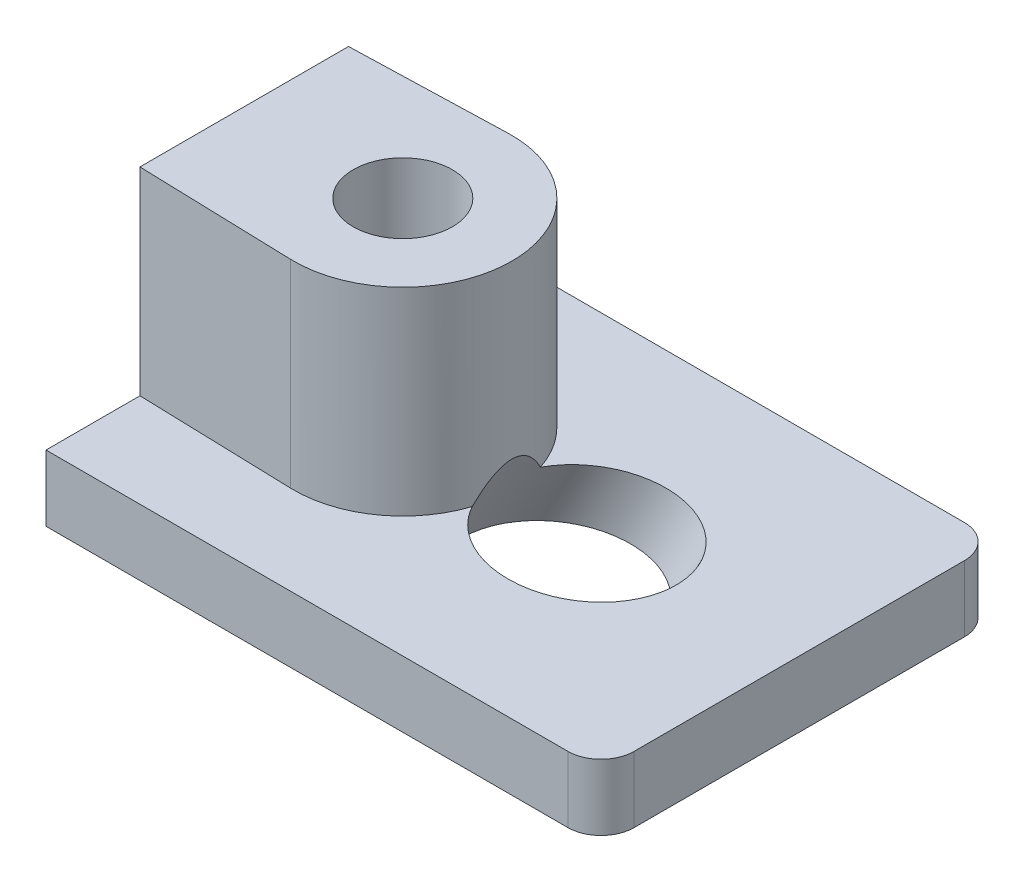
ISO-10303-21;
HEADER;
FILE_DESCRIPTION(('STEP AP214'),'2;1');
FILE_NAME('part.step','',(''),(''),'','','');
FILE_SCHEMA(('AUTOMOTIVE_DESIGN { 1 0 10303 214 1 1 1 1 }'));
ENDSEC;
DATA;
#1=APPLICATION_CONTEXT('core data for automotive mechanical design processes');
#2=APPLICATION_PROTOCOL_DEFINITION('international standard','automotive_design',2000,#1);
#3=PRODUCT_CONTEXT('',#1,'mechanical');
#4=PRODUCT('Part','Part','',(#3));
#5=PRODUCT_RELATED_PRODUCT_CATEGORY('part','',(#4));
#6=PRODUCT_DEFINITION_FORMATION('','',#4);
#7=PRODUCT_DEFINITION_CONTEXT('part definition',#1,'design');
#8=PRODUCT_DEFINITION('design','',#6,#7);
#9=PRODUCT_DEFINITION_SHAPE('','',#8);
#10=(LENGTH_UNIT() NAMED_UNIT(*) SI_UNIT(.MILLI.,.METRE.));
#11=(NAMED_UNIT(*) PLANE_ANGLE_UNIT() SI_UNIT($,.RADIAN.));
#12=(NAMED_UNIT(*) SI_UNIT($,.STERADIAN.) SOLID_ANGLE_UNIT());
#13=UNCERTAINTY_MEASURE_WITH_UNIT(LENGTH_MEASURE(1.E-05),#10,'distance_accuracy_value','');
#14=(GEOMETRIC_REPRESENTATION_CONTEXT(3) GLOBAL_UNCERTAINTY_ASSIGNED_CONTEXT((#13)) GLOBAL_UNIT_ASSIGNED_CONTEXT((#10,
#11,#12)) REPRESENTATION_CONTEXT('',''));
#15=CARTESIAN_POINT('',(0.,0.,0.));
#16=DIRECTION('',(0.,0.,1.));
#17=DIRECTION('',(1.,0.,0.));
#18=AXIS2_PLACEMENT_3D('',#15,#16,#17);
#19=CARTESIAN_POINT('',(2.5,9.25,0.));
#20=DIRECTION('',(0.,1.,0.));
#21=DIRECTION('',(0.,0.,1.));
#22=AXIS2_PLACEMENT_3D('',#19,#20,#21);
#23=PLANE('',#22);
#24=DIRECTION('',(0.,0.,1.));
#25=VECTOR('',#24,1.);
#26=CARTESIAN_POINT('',(1.30000000001017,9.25,-0.789194940442877));
#27=LINE('',#26,#25);
#28=CARTESIAN_POINT('',(1.30000000001017,9.25,-0.789194940442877));
#29=VERTEX_POINT('',#28);
#30=CARTESIAN_POINT('',(1.30000000001017,9.25,0.789194940442877));
#31=VERTEX_POINT('',#30);
#32=EDGE_CURVE('E123',#29,#31,#27,.T.);
#33=ORIENTED_EDGE('',*,*,#32,.T.);
#34=DIRECTION('',(0.99954579976556,0.,0.0301362600703331));
#35=VECTOR('',#34,1.);
#36=CARTESIAN_POINT('',(2.47513758544198,9.25,0.824625284806589));
#37=LINE('',#36,#35);
#38=CARTESIAN_POINT('',(2.47513758544198,9.25,0.824625284806589));
#39=VERTEX_POINT('',#38);
#40=EDGE_CURVE('E147',#31,#39,#37,.T.);
#41=ORIENTED_EDGE('',*,*,#40,.T.);
#42=CARTESIAN_POINT('',(2.5,9.25,0.));
#43=DIRECTION('',(0.,1.,0.));
#44=DIRECTION('',(0.,0.,1.));
#45=AXIS2_PLACEMENT_3D('',#42,#43,#44);
#46=CIRCLE('',#45,0.825000000000001);
#47=CARTESIAN_POINT('',(2.47513758544198,9.25,-0.824625284806588));
#48=VERTEX_POINT('',#47);
#49=EDGE_CURVE('E145',#39,#48,#46,.T.);
#50=ORIENTED_EDGE('',*,*,#49,.T.);
#51=DIRECTION('',(-0.99954579976556,0.,0.0301362600703313));
#52=VECTOR('',#51,1.);
#53=CARTESIAN_POINT('',(1.25,9.25,-0.787687442733241));
#54=LINE('',#53,#52);
#55=EDGE_CURVE('E137',#48,#29,#54,.T.);
#56=ORIENTED_EDGE('',*,*,#55,.T.);
#57=EDGE_LOOP('',(#33,#41,#50,#56));
#58=FACE_BOUND('',#57,.T.);
#59=CARTESIAN_POINT('',(2.5,9.25,0.));
#60=DIRECTION('',(0.,1.,0.));
#61=DIRECTION('',(0.,0.,1.));
#62=AXIS2_PLACEMENT_3D('',#59,#60,#61);
#63=CIRCLE('',#62,0.374999999999999);
#64=CARTESIAN_POINT('',(2.5,9.25,0.375000000000015));
#65=VERTEX_POINT('',#64);
#66=EDGE_CURVE('E218',#65,#65,#63,.T.);
#67=ORIENTED_EDGE('',*,*,#66,.F.);
#68=EDGE_LOOP('',(#67));
#69=FACE_BOUND('',#68,.T.);
#70=ADVANCED_FACE('F39',(#58,#69),#23,.T.);
#71=CARTESIAN_POINT('',(2.5,9.25,0.));
#72=DIRECTION('',(0.,-1.,0.));
#73=DIRECTION('',(0.,0.,-1.));
#74=AXIS2_PLACEMENT_3D('',#71,#72,#73);
#75=CYLINDRICAL_SURFACE('',#74,0.825000000000001);
#76=CARTESIAN_POINT('',(2.5,7.75,0.));
#77=DIRECTION('',(0.,1.,0.));
#78=DIRECTION('',(0.,0.,1.));
#79=AXIS2_PLACEMENT_3D('',#76,#77,#78);
#80=CIRCLE('',#79,0.825000000000001);
#81=CARTESIAN_POINT('',(2.47513758544198,7.75,0.824625284806589));
#82=VERTEX_POINT('',#81);
#83=CARTESIAN_POINT('',(3.28350083011511,7.75,0.25836301826875));
#84=VERTEX_POINT('',#83);
#85=EDGE_CURVE('E155',#82,#84,#80,.T.);
#86=ORIENTED_EDGE('',*,*,#85,.T.);
#87=CARTESIAN_POINT('',(3.28350083011511,7.75,0.25836301826875));
#88=CARTESIAN_POINT('',(3.28699629386318,7.76737167610386,0.247717695795738));
#89=CARTESIAN_POINT('',(3.29045746397856,7.78448758146414,0.236535022142881));
#90=CARTESIAN_POINT('',(3.29729263029284,7.81815195159373,0.212408271554126));
#91=CARTESIAN_POINT('',(3.30066185739445,7.83467320491001,0.199425248176802));
#92=CARTESIAN_POINT('',(3.30711403044603,7.86619807139703,0.171461122570827));
#93=CARTESIAN_POINT('',(3.3101953340927,7.88119301733646,0.156469620021036));
#94=CARTESIAN_POINT('',(3.31577706571615,7.90827880066202,0.124090209152378));
#95=CARTESIAN_POINT('',(3.31828357965726,7.92040011589495,0.106730843363555));
#96=CARTESIAN_POINT('',(3.32127084558138,7.9348215765627,0.0788883192918891));
#97=CARTESIAN_POINT('',(3.32213260135721,7.93897685197716,0.0694173488184373));
#98=CARTESIAN_POINT('',(3.32354615738824,7.94578891480867,0.0499200886747973));
#99=CARTESIAN_POINT('',(3.32409815277136,7.94844664558094,0.0398941529782815));
#100=CARTESIAN_POINT('',(3.32483491132341,7.95199328219456,0.0194333412467636));
#101=CARTESIAN_POINT('',(3.32501688143136,7.9528687349283,0.00899595677292589));
#102=CARTESIAN_POINT('',(3.32498062707693,7.95269427559984,-0.0118633448697021));
#103=CARTESIAN_POINT('',(3.3247623547405,7.95164413321211,-0.0222852600389373));
#104=CARTESIAN_POINT('',(3.32398893632226,7.94792075450384,-0.0419008258318341));
#105=CARTESIAN_POINT('',(3.32346365554792,7.94539140172208,-0.0511240747169399));
#106=CARTESIAN_POINT('',(3.32215104739102,7.93906567007573,-0.0690934351013614));
#107=CARTESIAN_POINT('',(3.32136374259963,7.93526940044204,-0.0778395876593072));
#108=CARTESIAN_POINT('',(3.31897190754394,7.9237240253382,-0.100578862908206));
#109=CARTESIAN_POINT('',(3.31717642734045,7.91504579337111,-0.114077082987652));
#110=CARTESIAN_POINT('',(3.31319719530162,7.89576674373529,-0.139658737731794));
#111=CARTESIAN_POINT('',(3.31101040177495,7.88515085059979,-0.151729761073553));
#112=CARTESIAN_POINT('',(3.30488396314836,7.8553267768583,-0.182105092880803));
#113=CARTESIAN_POINT('',(3.30073520753249,7.83504904238653,-0.19930638654706));
#114=CARTESIAN_POINT('',(3.29433648114911,7.80360095863935,-0.222974308083465));
#115=CARTESIAN_POINT('',(3.29220407060575,7.79309406405001,-0.230421520605261));
#116=CARTESIAN_POINT('',(3.28788815438002,7.77176907325318,-0.244771662623246));
#117=CARTESIAN_POINT('',(3.28570481309643,7.76095195786056,-0.25167609438423));
#118=CARTESIAN_POINT('',(3.28350083011511,7.75,-0.25836301826875));
#119=B_SPLINE_CURVE_WITH_KNOTS('',3,(#87,#88,#89,#90,#91,#92,#93,#94,#95,#96,#97,#98,#99,#100,
#101,#102,#103,#104,#105,#106,#107,#108,#109,#110,#111,#112,#113,#114,#115,#116,#117,#118),
.UNSPECIFIED.,.F.,.F.,(4,2,2,2,2,2,2,2,2,2,2,2,2,2,2,4),(0.,0.0620942702647684,
0.125840542327223,0.189930676463519,0.253307172073212,0.284338947974833,0.315351153969686,
0.346596593157476,0.377845769939034,0.406467691734566,0.435087146445608,0.483247703954785,
0.531800305579687,0.612190537944448,0.651346958262196,0.690390881410283),.UNSPECIFIED.);
#120=CARTESIAN_POINT('',(3.28350083011511,7.75,-0.25836301826875));
#121=VERTEX_POINT('',#120);
#122=EDGE_CURVE('E54',#84,#121,#119,.T.);
#123=ORIENTED_EDGE('',*,*,#122,.T.);
#124=CARTESIAN_POINT('',(2.47513758544198,7.75,-0.824625284806588));
#125=VERTEX_POINT('',#124);
#126=EDGE_CURVE('E158',#121,#125,#80,.T.);
#127=ORIENTED_EDGE('',*,*,#126,.T.);
#128=DIRECTION('',(0.,-1.,0.));
#129=VECTOR('',#128,1.);
#130=CARTESIAN_POINT('',(2.47513758544198,9.25,-0.824625284806588));
#131=LINE('',#130,#129);
#132=EDGE_CURVE('E163',#48,#125,#131,.T.);
#133=ORIENTED_EDGE('',*,*,#132,.F.);
#134=ORIENTED_EDGE('',*,*,#49,.F.);
#135=DIRECTION('',(0.,-1.,0.));
#136=VECTOR('',#135,1.);
#137=CARTESIAN_POINT('',(2.47513758544198,9.25,0.824625284806589));
#138=LINE('',#137,#136);
#139=EDGE_CURVE('E149',#39,#82,#138,.T.);
#140=ORIENTED_EDGE('',*,*,#139,.T.);
#141=EDGE_LOOP('',(#86,#123,#127,#133,#134,#140));
#142=FACE_BOUND('',#141,.T.);
#143=ADVANCED_FACE('F243',(#142),#75,.T.);
#144=CARTESIAN_POINT('',(1.25,9.25,-0.787687442733241));
#145=DIRECTION('',(0.0301362600703313,0.,0.99954579976556));
#146=DIRECTION('',(0.99954579976556,0.,-0.0301362600703313));
#147=AXIS2_PLACEMENT_3D('',#144,#145,#146);
#148=PLANE('',#147);
#149=DIRECTION('',(-0.99954579976556,0.,0.0301362600703313));
#150=VECTOR('',#149,1.);
#151=CARTESIAN_POINT('',(1.25,7.75,-0.787687442733241));
#152=LINE('',#151,#150);
#153=CARTESIAN_POINT('',(1.30000000001017,7.75,-0.789194940442877));
#154=VERTEX_POINT('',#153);
#155=EDGE_CURVE('E140',#125,#154,#152,.T.);
#156=ORIENTED_EDGE('',*,*,#155,.T.);
#157=DIRECTION('',(0.,-1.,0.));
#158=VECTOR('',#157,1.);
#159=CARTESIAN_POINT('',(1.30000000001017,9.25,-0.789194940442877));
#160=LINE('',#159,#158);
#161=EDGE_CURVE('E127',#29,#154,#160,.T.);
#162=ORIENTED_EDGE('',*,*,#161,.F.);
#163=ORIENTED_EDGE('',*,*,#55,.F.);
#164=ORIENTED_EDGE('',*,*,#132,.T.);
#165=EDGE_LOOP('',(#156,#162,#163,#164));
#166=FACE_BOUND('',#165,.T.);
#167=ADVANCED_FACE('F135',(#166),#148,.F.);
#168=CARTESIAN_POINT('',(2.47513758544198,9.25,0.824625284806589));
#169=DIRECTION('',(0.0301362600703331,0.,-0.99954579976556));
#170=DIRECTION('',(-0.99954579976556,0.,-0.0301362600703331));
#171=AXIS2_PLACEMENT_3D('',#168,#169,#170);
#172=PLANE('',#171);
#173=ORIENTED_EDGE('',*,*,#40,.F.);
#174=DIRECTION('',(0.,-1.,0.));
#175=VECTOR('',#174,1.);
#176=CARTESIAN_POINT('',(1.30000000001017,9.25,0.789194940442877));
#177=LINE('',#176,#175);
#178=CARTESIAN_POINT('',(1.30000000001017,7.75,0.789194940442877));
#179=VERTEX_POINT('',#178);
#180=EDGE_CURVE('E129',#31,#179,#177,.T.);
#181=ORIENTED_EDGE('',*,*,#180,.T.);
#182=DIRECTION('',(0.99954579976556,0.,0.0301362600703331));
#183=VECTOR('',#182,1.);
#184=CARTESIAN_POINT('',(2.47513758544198,7.75,0.824625284806589));
#185=LINE('',#184,#183);
#186=EDGE_CURVE('E151',#179,#82,#185,.T.);
#187=ORIENTED_EDGE('',*,*,#186,.T.);
#188=ORIENTED_EDGE('',*,*,#139,.F.);
#189=EDGE_LOOP('',(#173,#181,#187,#188));
#190=FACE_BOUND('',#189,.T.);
#191=ADVANCED_FACE('F227',(#190),#172,.F.);
#192=CARTESIAN_POINT('',(2.5,9.25,0.));
#193=DIRECTION('',(0.,-1.,0.));
#194=DIRECTION('',(0.,0.,-1.));
#195=AXIS2_PLACEMENT_3D('',#192,#193,#194);
#196=CYLINDRICAL_SURFACE('',#195,0.374999999999999);
#197=ORIENTED_EDGE('',*,*,#66,.T.);
#198=EDGE_LOOP('',(#197));
#199=FACE_BOUND('',#198,.T.);
#200=CARTESIAN_POINT('',(2.5,7.75,0.));
#201=DIRECTION('',(0.,1.,0.));
#202=DIRECTION('',(0.,0.,1.));
#203=AXIS2_PLACEMENT_3D('',#200,#201,#202);
#204=CIRCLE('',#203,0.374999999999999);
#205=CARTESIAN_POINT('',(2.5,7.75,0.375000000000015));
#206=VERTEX_POINT('',#205);
#207=EDGE_CURVE('E217',#206,#206,#204,.T.);
#208=ORIENTED_EDGE('',*,*,#207,.F.);
#209=EDGE_LOOP('',(#208));
#210=FACE_BOUND('',#209,.T.);
#211=ADVANCED_FACE('F225',(#199,#210),#196,.F.);
#212=CARTESIAN_POINT('',(0.,7.75,0.));
#213=DIRECTION('',(0.,-1.,0.));
#214=DIRECTION('',(1.,0.,0.));
#215=AXIS2_PLACEMENT_3D('',#212,#213,#214);
#216=PLANE('',#215);
#217=ORIENTED_EDGE('',*,*,#126,.F.);
#218=CARTESIAN_POINT('',(3.89333333334351,7.75,0.));
#219=DIRECTION('',(0.,-1.,0.));
#220=DIRECTION('',(1.,0.,0.));
#221=AXIS2_PLACEMENT_3D('',#218,#219,#220);
#222=ELLIPSE('',#221,0.676486666600938,0.596899999942004);
#223=EDGE_CURVE('E260',#121,#84,#222,.T.);
#224=ORIENTED_EDGE('',*,*,#223,.T.);
#225=ORIENTED_EDGE('',*,*,#85,.F.);
#226=ORIENTED_EDGE('',*,*,#186,.F.);
#227=DIRECTION('',(0.,0.,-1.));
#228=VECTOR('',#227,1.);
#229=CARTESIAN_POINT('',(1.30000000001017,7.75,1.49999999996326));
#230=LINE('',#229,#228);
#231=CARTESIAN_POINT('',(1.30000000001017,7.75,1.49999999996326));
#232=VERTEX_POINT('',#231);
#233=EDGE_CURVE('E207',#232,#179,#230,.T.);
#234=ORIENTED_EDGE('',*,*,#233,.F.);
#235=DIRECTION('',(-1.,0.,0.));
#236=VECTOR('',#235,1.);
#237=CARTESIAN_POINT('',(5.50000000001017,7.75,1.49999999996326));
#238=LINE('',#237,#236);
#239=CARTESIAN_POINT('',(5.25000000001017,7.75,1.49999999996326));
#240=VERTEX_POINT('',#239);
#241=EDGE_CURVE('E297',#240,#232,#238,.T.);
#242=ORIENTED_EDGE('',*,*,#241,.F.);
#243=CARTESIAN_POINT('',(5.25000000001017,7.75,1.24999999996326));
#244=DIRECTION('',(0.,-1.,0.));
#245=DIRECTION('',(1.,0.,0.));
#246=AXIS2_PLACEMENT_3D('',#243,#244,#245);
#247=CIRCLE('',#246,0.25);
#248=CARTESIAN_POINT('',(5.50000000001017,7.75,1.24999999996326));
#249=VERTEX_POINT('',#248);
#250=EDGE_CURVE('E170',#240,#249,#247,.F.);
#251=ORIENTED_EDGE('',*,*,#250,.T.);
#252=DIRECTION('',(0.,0.,1.));
#253=VECTOR('',#252,1.);
#254=CARTESIAN_POINT('',(5.50000000001017,7.75,1.49999999996326));
#255=LINE('',#254,#253);
#256=CARTESIAN_POINT('',(5.50000000001017,7.75,-1.25000000003674));
#257=VERTEX_POINT('',#256);
#258=EDGE_CURVE('E201',#257,#249,#255,.T.);
#259=ORIENTED_EDGE('',*,*,#258,.F.);
#260=CARTESIAN_POINT('',(5.25000000001017,7.75,-1.25000000003674));
#261=DIRECTION('',(0.,-1.,0.));
#262=DIRECTION('',(1.,0.,0.));
#263=AXIS2_PLACEMENT_3D('',#260,#261,#262);
#264=CIRCLE('',#263,0.25);
#265=CARTESIAN_POINT('',(5.25000000001017,7.75,-1.50000000003674));
#266=VERTEX_POINT('',#265);
#267=EDGE_CURVE('E172',#257,#266,#264,.F.);
#268=ORIENTED_EDGE('',*,*,#267,.T.);
#269=DIRECTION('',(1.,0.,0.));
#270=VECTOR('',#269,1.);
#271=CARTESIAN_POINT('',(1.30000000001017,7.75,-1.50000000003674));
#272=LINE('',#271,#270);
#273=CARTESIAN_POINT('',(1.30000000001017,7.75,-1.50000000003674));
#274=VERTEX_POINT('',#273);
#275=EDGE_CURVE('E193',#274,#266,#272,.T.);
#276=ORIENTED_EDGE('',*,*,#275,.F.);
#277=EDGE_CURVE('E209',#154,#274,#230,.T.);
#278=ORIENTED_EDGE('',*,*,#277,.F.);
#279=ORIENTED_EDGE('',*,*,#155,.F.);
#280=EDGE_LOOP('',(#217,#224,#225,#226,#234,#242,#251,#259,#268,#276,#278,#279));
#281=FACE_BOUND('',#280,.T.);
#282=ADVANCED_FACE('F200',(#281),#216,.F.);
#283=CARTESIAN_POINT('',(0.,7.25,0.));
#284=DIRECTION('',(0.,-1.,0.));
#285=DIRECTION('',(1.,0.,0.));
#286=AXIS2_PLACEMENT_3D('',#283,#284,#285);
#287=PLANE('',#286);
#288=CARTESIAN_POINT('',(3.62666666667684,7.25,0.));
#289=DIRECTION('',(0.,-1.,0.));
#290=DIRECTION('',(1.,0.,0.));
#291=AXIS2_PLACEMENT_3D('',#288,#289,#290);
#292=ELLIPSE('',#291,0.676486666600938,0.596899999942004);
#293=CARTESIAN_POINT('',(4.30315333327778,7.25,0.));
#294=VERTEX_POINT('',#293);
#295=EDGE_CURVE('E43',#294,#294,#292,.T.);
#296=ORIENTED_EDGE('',*,*,#295,.F.);
#297=EDGE_LOOP('',(#296));
#298=FACE_BOUND('',#297,.T.);
#299=DIRECTION('',(1.,0.,0.));
#300=VECTOR('',#299,1.);
#301=CARTESIAN_POINT('',(1.30000000001017,7.25,-1.50000000003674));
#302=LINE('',#301,#300);
#303=CARTESIAN_POINT('',(1.30000000001017,7.25,-1.50000000003674));
#304=VERTEX_POINT('',#303);
#305=CARTESIAN_POINT('',(5.25000000001017,7.25,-1.50000000003674));
#306=VERTEX_POINT('',#305);
#307=EDGE_CURVE('E183',#304,#306,#302,.T.);
#308=ORIENTED_EDGE('',*,*,#307,.T.);
#309=CARTESIAN_POINT('',(5.25000000001017,7.25,-1.25000000003674));
#310=DIRECTION('',(0.,-1.,0.));
#311=DIRECTION('',(1.,0.,0.));
#312=AXIS2_PLACEMENT_3D('',#309,#310,#311);
#313=CIRCLE('',#312,0.25);
#314=CARTESIAN_POINT('',(5.50000000001017,7.25,-1.25000000003674));
#315=VERTEX_POINT('',#314);
#316=EDGE_CURVE('E48',#306,#315,#313,.T.);
#317=ORIENTED_EDGE('',*,*,#316,.T.);
#318=DIRECTION('',(0.,0.,1.));
#319=VECTOR('',#318,1.);
#320=CARTESIAN_POINT('',(5.50000000001017,7.25,1.49999999996326));
#321=LINE('',#320,#319);
#322=CARTESIAN_POINT('',(5.50000000001017,7.25,1.24999999996326));
#323=VERTEX_POINT('',#322);
#324=EDGE_CURVE('E181',#315,#323,#321,.T.);
#325=ORIENTED_EDGE('',*,*,#324,.T.);
#326=CARTESIAN_POINT('',(5.25000000001017,7.25,1.24999999996326));
#327=DIRECTION('',(0.,-1.,0.));
#328=DIRECTION('',(1.,0.,0.));
#329=AXIS2_PLACEMENT_3D('',#326,#327,#328);
#330=CIRCLE('',#329,0.25);
#331=CARTESIAN_POINT('',(5.25000000001017,7.25,1.49999999996326));
#332=VERTEX_POINT('',#331);
#333=EDGE_CURVE('E62',#323,#332,#330,.T.);
#334=ORIENTED_EDGE('',*,*,#333,.T.);
#335=DIRECTION('',(-1.,0.,0.));
#336=VECTOR('',#335,1.);
#337=CARTESIAN_POINT('',(5.50000000001017,7.25,1.49999999996326));
#338=LINE('',#337,#336);
#339=CARTESIAN_POINT('',(1.30000000001017,7.25,1.49999999996326));
#340=VERTEX_POINT('',#339);
#341=EDGE_CURVE('E192',#332,#340,#338,.T.);
#342=ORIENTED_EDGE('',*,*,#341,.T.);
#343=DIRECTION('',(0.,0.,-1.));
#344=VECTOR('',#343,1.);
#345=CARTESIAN_POINT('',(1.30000000001017,7.25,1.49999999996326));
#346=LINE('',#345,#344);
#347=EDGE_CURVE('E303',#340,#304,#346,.T.);
#348=ORIENTED_EDGE('',*,*,#347,.T.);
#349=EDGE_LOOP('',(#308,#317,#325,#334,#342,#348));
#350=FACE_BOUND('',#349,.T.);
#351=ADVANCED_FACE('F180',(#298,#350),#287,.T.);
#352=CARTESIAN_POINT('',(1.30000000001017,7.25,-1.50000000003674));
#353=DIRECTION('',(0.,0.,1.));
#354=DIRECTION('',(0.,-1.,0.));
#355=AXIS2_PLACEMENT_3D('',#352,#353,#354);
#356=PLANE('',#355);
#357=ORIENTED_EDGE('',*,*,#275,.T.);
#358=DIRECTION('',(0.,1.,0.));
#359=VECTOR('',#358,1.);
#360=CARTESIAN_POINT('',(5.25000000001017,7.25,-1.50000000003674));
#361=LINE('',#360,#359);
#362=EDGE_CURVE('E174',#266,#306,#361,.F.);
#363=ORIENTED_EDGE('',*,*,#362,.T.);
#364=ORIENTED_EDGE('',*,*,#307,.F.);
#365=DIRECTION('',(0.,1.,0.));
#366=VECTOR('',#365,1.);
#367=CARTESIAN_POINT('',(1.30000000001017,7.25,-1.50000000003674));
#368=LINE('',#367,#366);
#369=EDGE_CURVE('E206',#304,#274,#368,.T.);
#370=ORIENTED_EDGE('',*,*,#369,.T.);
#371=EDGE_LOOP('',(#357,#363,#364,#370));
#372=FACE_BOUND('',#371,.T.);
#373=ADVANCED_FACE('F204',(#372),#356,.F.);
#374=CARTESIAN_POINT('',(1.30000000001017,7.25,1.49999999996326));
#375=DIRECTION('',(1.,0.,0.));
#376=DIRECTION('',(0.,1.,0.));
#377=AXIS2_PLACEMENT_3D('',#374,#375,#376);
#378=PLANE('',#377);
#379=ORIENTED_EDGE('',*,*,#233,.T.);
#380=ORIENTED_EDGE('',*,*,#180,.F.);
#381=ORIENTED_EDGE('',*,*,#32,.F.);
#382=ORIENTED_EDGE('',*,*,#161,.T.);
#383=ORIENTED_EDGE('',*,*,#277,.T.);
#384=ORIENTED_EDGE('',*,*,#369,.F.);
#385=ORIENTED_EDGE('',*,*,#347,.F.);
#386=DIRECTION('',(0.,1.,0.));
#387=VECTOR('',#386,1.);
#388=CARTESIAN_POINT('',(1.30000000001017,7.25,1.49999999996326));
#389=LINE('',#388,#387);
#390=EDGE_CURVE('E214',#340,#232,#389,.T.);
#391=ORIENTED_EDGE('',*,*,#390,.T.);
#392=EDGE_LOOP('',(#379,#380,#381,#382,#383,#384,#385,#391));
#393=FACE_BOUND('',#392,.T.);
#394=ADVANCED_FACE('F126',(#393),#378,.F.);
#395=CARTESIAN_POINT('',(5.50000000001017,7.25,1.49999999996326));
#396=DIRECTION('',(0.,0.,-1.));
#397=DIRECTION('',(0.,1.,0.));
#398=AXIS2_PLACEMENT_3D('',#395,#396,#397);
#399=PLANE('',#398);
#400=ORIENTED_EDGE('',*,*,#341,.F.);
#401=DIRECTION('',(0.,1.,0.));
#402=VECTOR('',#401,1.);
#403=CARTESIAN_POINT('',(5.25000000001017,7.25,1.49999999996326));
#404=LINE('',#403,#402);
#405=EDGE_CURVE('E11',#332,#240,#404,.T.);
#406=ORIENTED_EDGE('',*,*,#405,.T.);
#407=ORIENTED_EDGE('',*,*,#241,.T.);
#408=ORIENTED_EDGE('',*,*,#390,.F.);
#409=EDGE_LOOP('',(#400,#406,#407,#408));
#410=FACE_BOUND('',#409,.T.);
#411=ADVANCED_FACE('F274',(#410),#399,.F.);
#412=CARTESIAN_POINT('',(5.50000000001017,7.25,1.49999999996326));
#413=DIRECTION('',(-1.,0.,0.));
#414=DIRECTION('',(0.,-1.,0.));
#415=AXIS2_PLACEMENT_3D('',#412,#413,#414);
#416=PLANE('',#415);
#417=ORIENTED_EDGE('',*,*,#324,.F.);
#418=DIRECTION('',(0.,1.,0.));
#419=VECTOR('',#418,1.);
#420=CARTESIAN_POINT('',(5.50000000001017,7.25,-1.25000000003674));
#421=LINE('',#420,#419);
#422=EDGE_CURVE('E167',#315,#257,#421,.T.);
#423=ORIENTED_EDGE('',*,*,#422,.T.);
#424=ORIENTED_EDGE('',*,*,#258,.T.);
#425=DIRECTION('',(0.,1.,0.));
#426=VECTOR('',#425,1.);
#427=CARTESIAN_POINT('',(5.50000000001017,7.25,1.24999999996326));
#428=LINE('',#427,#426);
#429=EDGE_CURVE('E165',#249,#323,#428,.F.);
#430=ORIENTED_EDGE('',*,*,#429,.T.);
#431=EDGE_LOOP('',(#417,#423,#424,#430));
#432=FACE_BOUND('',#431,.T.);
#433=ADVANCED_FACE('F188',(#432),#416,.F.);
#434=ORIENTED_EDGE('',*,*,#207,.T.);
#435=EDGE_LOOP('',(#434));
#436=FACE_BOUND('',#435,.T.);
#437=ADVANCED_FACE('F223',(#436),#216,.F.);
#438=CARTESIAN_POINT('',(5.25000000001017,7.25,-1.25000000003674));
#439=DIRECTION('',(0.,1.,0.));
#440=DIRECTION('',(-1.,0.,0.));
#441=AXIS2_PLACEMENT_3D('',#438,#439,#440);
#442=CYLINDRICAL_SURFACE('',#441,0.25);
#443=ORIENTED_EDGE('',*,*,#316,.F.);
#444=ORIENTED_EDGE('',*,*,#362,.F.);
#445=ORIENTED_EDGE('',*,*,#267,.F.);
#446=ORIENTED_EDGE('',*,*,#422,.F.);
#447=EDGE_LOOP('',(#443,#444,#445,#446));
#448=FACE_BOUND('',#447,.T.);
#449=ADVANCED_FACE('F195',(#448),#442,.T.);
#450=CARTESIAN_POINT('',(5.25000000001017,7.25,1.24999999996326));
#451=DIRECTION('',(0.,1.,0.));
#452=DIRECTION('',(-1.,0.,0.));
#453=AXIS2_PLACEMENT_3D('',#450,#451,#452);
#454=CYLINDRICAL_SURFACE('',#453,0.25);
#455=ORIENTED_EDGE('',*,*,#333,.F.);
#456=ORIENTED_EDGE('',*,*,#429,.F.);
#457=ORIENTED_EDGE('',*,*,#250,.F.);
#458=ORIENTED_EDGE('',*,*,#405,.F.);
#459=EDGE_LOOP('',(#455,#456,#457,#458));
#460=FACE_BOUND('',#459,.T.);
#461=ADVANCED_FACE('F41',(#460),#454,.T.);
#462=CARTESIAN_POINT('',(0.352941176480766,1.11176470588234,0.));
#463=DIRECTION('',(0.470588235294117,0.882352941176471,0.));
#464=DIRECTION('',(-0.882352941176471,0.470588235294117,0.));
#465=AXIS2_PLACEMENT_3D('',#462,#463,#464);
#466=CYLINDRICAL_SURFACE('',#465,0.596899999942004);
#467=ORIENTED_EDGE('',*,*,#295,.T.);
#468=EDGE_LOOP('',(#467));
#469=FACE_BOUND('',#468,.T.);
#470=ORIENTED_EDGE('',*,*,#223,.F.);
#471=ORIENTED_EDGE('',*,*,#122,.F.);
#472=EDGE_LOOP('',(#470,#471));
#473=FACE_BOUND('',#472,.T.);
#474=ADVANCED_FACE('F262',(#469,#473),#466,.F.);
#475=CLOSED_SHELL('',(#70,#143,#167,#191,#211,#282,#351,#373,#394,#411,#433,#437,#449,#461,#474));
#476=MANIFOLD_SOLID_BREP('B2',#475);
#477=ADVANCED_BREP_SHAPE_REPRESENTATION('',(#18,#476),#14);
#478=SHAPE_DEFINITION_REPRESENTATION(#9,#477);
ENDSEC;
END-ISO-10303-21;
